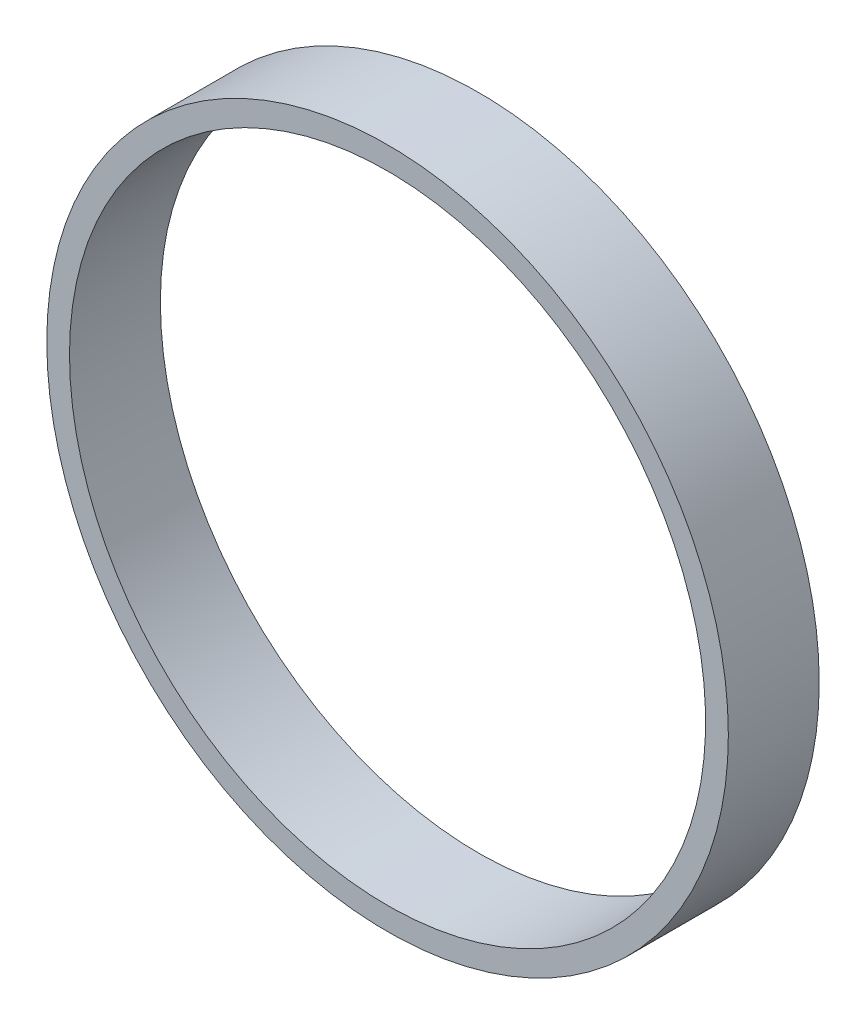
ISO-10303-21;
HEADER;
FILE_DESCRIPTION(('STEP AP214'),'2;1');
FILE_NAME('part.step','',(''),(''),'','','');
FILE_SCHEMA(('AUTOMOTIVE_DESIGN { 1 0 10303 214 1 1 1 1 }'));
ENDSEC;
DATA;
#1=APPLICATION_CONTEXT('core data for automotive mechanical design processes');
#2=APPLICATION_PROTOCOL_DEFINITION('international standard','automotive_design',2000,#1);
#3=PRODUCT_CONTEXT('',#1,'mechanical');
#4=PRODUCT('Part','Part','',(#3));
#5=PRODUCT_RELATED_PRODUCT_CATEGORY('part','',(#4));
#6=PRODUCT_DEFINITION_FORMATION('','',#4);
#7=PRODUCT_DEFINITION_CONTEXT('part definition',#1,'design');
#8=PRODUCT_DEFINITION('design','',#6,#7);
#9=PRODUCT_DEFINITION_SHAPE('','',#8);
#10=(LENGTH_UNIT() NAMED_UNIT(*) SI_UNIT(.MILLI.,.METRE.));
#11=(NAMED_UNIT(*) PLANE_ANGLE_UNIT() SI_UNIT($,.RADIAN.));
#12=(NAMED_UNIT(*) SI_UNIT($,.STERADIAN.) SOLID_ANGLE_UNIT());
#13=UNCERTAINTY_MEASURE_WITH_UNIT(LENGTH_MEASURE(1.E-05),#10,'distance_accuracy_value','');
#14=(GEOMETRIC_REPRESENTATION_CONTEXT(3) GLOBAL_UNCERTAINTY_ASSIGNED_CONTEXT((#13)) GLOBAL_UNIT_ASSIGNED_CONTEXT((#10,
#11,#12)) REPRESENTATION_CONTEXT('',''));
#15=CARTESIAN_POINT('',(0.,0.,0.));
#16=DIRECTION('',(0.,0.,1.));
#17=DIRECTION('',(1.,0.,0.));
#18=AXIS2_PLACEMENT_3D('',#15,#16,#17);
#19=CARTESIAN_POINT('',(21.,0.,0.));
#20=DIRECTION('',(0.,0.,-1.));
#21=DIRECTION('',(-1.,0.,0.));
#22=AXIS2_PLACEMENT_3D('',#19,#20,#21);
#23=PLANE('',#22);
#24=CARTESIAN_POINT('',(0.,0.,0.));
#25=DIRECTION('',(0.,0.,-1.));
#26=DIRECTION('',(-1.,0.,0.));
#27=AXIS2_PLACEMENT_3D('',#24,#25,#26);
#28=CIRCLE('',#27,22.5);
#29=CARTESIAN_POINT('',(-22.5,0.,0.));
#30=VERTEX_POINT('',#29);
#31=EDGE_CURVE('E10',#30,#30,#28,.T.);
#32=ORIENTED_EDGE('',*,*,#31,.T.);
#33=EDGE_LOOP('',(#32));
#34=FACE_BOUND('',#33,.T.);
#35=CARTESIAN_POINT('',(0.,0.,0.));
#36=DIRECTION('',(0.,0.,-1.));
#37=DIRECTION('',(-1.,0.,0.));
#38=AXIS2_PLACEMENT_3D('',#35,#36,#37);
#39=CIRCLE('',#38,21.);
#40=CARTESIAN_POINT('',(-21.,0.,0.));
#41=VERTEX_POINT('',#40);
#42=EDGE_CURVE('E45',#41,#41,#39,.T.);
#43=ORIENTED_EDGE('',*,*,#42,.F.);
#44=EDGE_LOOP('',(#43));
#45=FACE_BOUND('',#44,.T.);
#46=ADVANCED_FACE('F31',(#34,#45),#23,.T.);
#47=CARTESIAN_POINT('',(0.,0.,6.));
#48=DIRECTION('',(0.,0.,-1.));
#49=DIRECTION('',(-1.,0.,0.));
#50=AXIS2_PLACEMENT_3D('',#47,#48,#49);
#51=CYLINDRICAL_SURFACE('',#50,22.5);
#52=CARTESIAN_POINT('',(0.,0.,6.));
#53=DIRECTION('',(0.,0.,-1.));
#54=DIRECTION('',(-1.,0.,0.));
#55=AXIS2_PLACEMENT_3D('',#52,#53,#54);
#56=CIRCLE('',#55,22.5);
#57=CARTESIAN_POINT('',(-22.5,0.,6.));
#58=VERTEX_POINT('',#57);
#59=EDGE_CURVE('E37',#58,#58,#56,.T.);
#60=ORIENTED_EDGE('',*,*,#59,.T.);
#61=EDGE_LOOP('',(#60));
#62=FACE_BOUND('',#61,.T.);
#63=ORIENTED_EDGE('',*,*,#31,.F.);
#64=EDGE_LOOP('',(#63));
#65=FACE_BOUND('',#64,.T.);
#66=ADVANCED_FACE('F55',(#62,#65),#51,.T.);
#67=CARTESIAN_POINT('',(22.5,0.,6.));
#68=DIRECTION('',(0.,0.,1.));
#69=DIRECTION('',(1.,0.,0.));
#70=AXIS2_PLACEMENT_3D('',#67,#68,#69);
#71=PLANE('',#70);
#72=CARTESIAN_POINT('',(0.,0.,6.));
#73=DIRECTION('',(0.,0.,-1.));
#74=DIRECTION('',(-1.,0.,0.));
#75=AXIS2_PLACEMENT_3D('',#72,#73,#74);
#76=CIRCLE('',#75,21.);
#77=CARTESIAN_POINT('',(-21.,0.,6.));
#78=VERTEX_POINT('',#77);
#79=EDGE_CURVE('E41',#78,#78,#76,.T.);
#80=ORIENTED_EDGE('',*,*,#79,.T.);
#81=EDGE_LOOP('',(#80));
#82=FACE_BOUND('',#81,.T.);
#83=ORIENTED_EDGE('',*,*,#59,.F.);
#84=EDGE_LOOP('',(#83));
#85=FACE_BOUND('',#84,.T.);
#86=ADVANCED_FACE('F59',(#82,#85),#71,.T.);
#87=CARTESIAN_POINT('',(0.,0.,6.));
#88=DIRECTION('',(0.,0.,-1.));
#89=DIRECTION('',(-1.,0.,0.));
#90=AXIS2_PLACEMENT_3D('',#87,#88,#89);
#91=CYLINDRICAL_SURFACE('',#90,21.);
#92=ORIENTED_EDGE('',*,*,#42,.T.);
#93=EDGE_LOOP('',(#92));
#94=FACE_BOUND('',#93,.T.);
#95=ORIENTED_EDGE('',*,*,#79,.F.);
#96=EDGE_LOOP('',(#95));
#97=FACE_BOUND('',#96,.T.);
#98=ADVANCED_FACE('F51',(#94,#97),#91,.F.);
#99=CLOSED_SHELL('',(#46,#66,#86,#98));
#100=MANIFOLD_SOLID_BREP('B2',#99);
#101=ADVANCED_BREP_SHAPE_REPRESENTATION('',(#18,#100),#14);
#102=SHAPE_DEFINITION_REPRESENTATION(#9,#101);
ENDSEC;
END-ISO-10303-21;
